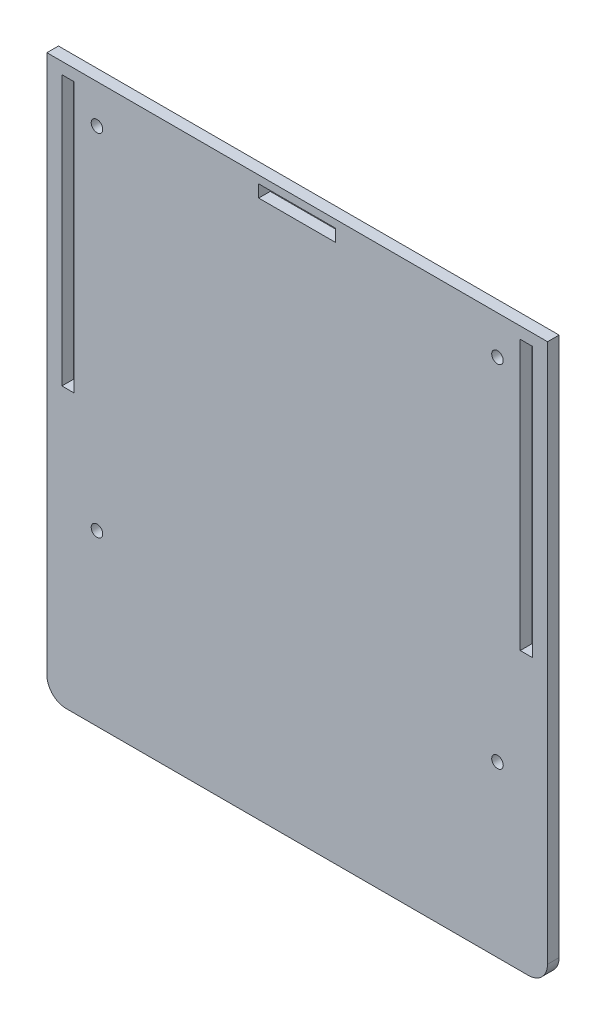
ISO-10303-21;
HEADER;
FILE_DESCRIPTION(('STEP AP214'),'2;1');
FILE_NAME('part.step','',(''),(''),'','','');
FILE_SCHEMA(('AUTOMOTIVE_DESIGN { 1 0 10303 214 1 1 1 1 }'));
ENDSEC;
DATA;
#1=APPLICATION_CONTEXT('core data for automotive mechanical design processes');
#2=APPLICATION_PROTOCOL_DEFINITION('international standard','automotive_design',2000,#1);
#3=PRODUCT_CONTEXT('',#1,'mechanical');
#4=PRODUCT('Part','Part','',(#3));
#5=PRODUCT_RELATED_PRODUCT_CATEGORY('part','',(#4));
#6=PRODUCT_DEFINITION_FORMATION('','',#4);
#7=PRODUCT_DEFINITION_CONTEXT('part definition',#1,'design');
#8=PRODUCT_DEFINITION('design','',#6,#7);
#9=PRODUCT_DEFINITION_SHAPE('','',#8);
#10=(LENGTH_UNIT() NAMED_UNIT(*) SI_UNIT(.MILLI.,.METRE.));
#11=(NAMED_UNIT(*) PLANE_ANGLE_UNIT() SI_UNIT($,.RADIAN.));
#12=(NAMED_UNIT(*) SI_UNIT($,.STERADIAN.) SOLID_ANGLE_UNIT());
#13=UNCERTAINTY_MEASURE_WITH_UNIT(LENGTH_MEASURE(1.E-05),#10,'distance_accuracy_value','');
#14=(GEOMETRIC_REPRESENTATION_CONTEXT(3) GLOBAL_UNCERTAINTY_ASSIGNED_CONTEXT((#13)) GLOBAL_UNIT_ASSIGNED_CONTEXT((#10,
#11,#12)) REPRESENTATION_CONTEXT('',''));
#15=CARTESIAN_POINT('',(0.,0.,0.));
#16=DIRECTION('',(0.,0.,1.));
#17=DIRECTION('',(1.,0.,0.));
#18=AXIS2_PLACEMENT_3D('',#15,#16,#17);
#19=CARTESIAN_POINT('',(60.,-70.,3.));
#20=DIRECTION('',(0.,0.,-1.));
#21=DIRECTION('',(-1.,0.,0.));
#22=AXIS2_PLACEMENT_3D('',#19,#20,#21);
#23=PLANE('',#22);
#24=DIRECTION('',(0.,1.,0.));
#25=VECTOR('',#24,1.);
#26=CARTESIAN_POINT('',(61.1,67.,3.));
#27=LINE('',#26,#25);
#28=CARTESIAN_POINT('',(61.1,-3.,3.));
#29=VERTEX_POINT('',#28);
#30=CARTESIAN_POINT('',(61.1,67.,3.));
#31=VERTEX_POINT('',#30);
#32=EDGE_CURVE('E216',#29,#31,#27,.T.);
#33=ORIENTED_EDGE('',*,*,#32,.F.);
#34=DIRECTION('',(1.,0.,0.));
#35=VECTOR('',#34,1.);
#36=CARTESIAN_POINT('',(57.9,-3.,3.));
#37=LINE('',#36,#35);
#38=CARTESIAN_POINT('',(57.9,-3.,3.));
#39=VERTEX_POINT('',#38);
#40=EDGE_CURVE('E227',#39,#29,#37,.T.);
#41=ORIENTED_EDGE('',*,*,#40,.F.);
#42=DIRECTION('',(0.,-1.,0.));
#43=VECTOR('',#42,1.);
#44=CARTESIAN_POINT('',(57.9,67.,3.));
#45=LINE('',#44,#43);
#46=CARTESIAN_POINT('',(57.9,67.,3.));
#47=VERTEX_POINT('',#46);
#48=EDGE_CURVE('E223',#47,#39,#45,.T.);
#49=ORIENTED_EDGE('',*,*,#48,.F.);
#50=DIRECTION('',(-1.,0.,0.));
#51=VECTOR('',#50,1.);
#52=CARTESIAN_POINT('',(61.1,67.,3.));
#53=LINE('',#52,#51);
#54=EDGE_CURVE('E219',#31,#47,#53,.T.);
#55=ORIENTED_EDGE('',*,*,#54,.F.);
#56=EDGE_LOOP('',(#33,#41,#49,#55));
#57=FACE_BOUND('',#56,.T.);
#58=DIRECTION('',(-1.,0.,0.));
#59=VECTOR('',#58,1.);
#60=CARTESIAN_POINT('',(-65.,70.,3.));
#61=LINE('',#60,#59);
#62=CARTESIAN_POINT('',(65.,70.,3.));
#63=VERTEX_POINT('',#62);
#64=CARTESIAN_POINT('',(-65.,70.,3.));
#65=VERTEX_POINT('',#64);
#66=EDGE_CURVE('E302',#63,#65,#61,.T.);
#67=ORIENTED_EDGE('',*,*,#66,.T.);
#68=DIRECTION('',(0.,-1.,0.));
#69=VECTOR('',#68,1.);
#70=CARTESIAN_POINT('',(-65.,-70.,3.));
#71=LINE('',#70,#69);
#72=CARTESIAN_POINT('',(-65.,-70.,3.));
#73=VERTEX_POINT('',#72);
#74=EDGE_CURVE('E306',#65,#73,#71,.T.);
#75=ORIENTED_EDGE('',*,*,#74,.T.);
#76=CARTESIAN_POINT('',(-60.,-70.,3.));
#77=DIRECTION('',(0.,0.,1.));
#78=DIRECTION('',(-1.,0.,0.));
#79=AXIS2_PLACEMENT_3D('',#76,#77,#78);
#80=CIRCLE('',#79,5.);
#81=CARTESIAN_POINT('',(-60.,-75.,3.));
#82=VERTEX_POINT('',#81);
#83=EDGE_CURVE('E310',#73,#82,#80,.T.);
#84=ORIENTED_EDGE('',*,*,#83,.T.);
#85=DIRECTION('',(1.,0.,0.));
#86=VECTOR('',#85,1.);
#87=CARTESIAN_POINT('',(-60.,-75.,3.));
#88=LINE('',#87,#86);
#89=CARTESIAN_POINT('',(60.,-75.,3.));
#90=VERTEX_POINT('',#89);
#91=EDGE_CURVE('E313',#82,#90,#88,.T.);
#92=ORIENTED_EDGE('',*,*,#91,.T.);
#93=CARTESIAN_POINT('',(60.,-70.,3.));
#94=DIRECTION('',(0.,0.,1.));
#95=DIRECTION('',(-1.,0.,0.));
#96=AXIS2_PLACEMENT_3D('',#93,#94,#95);
#97=CIRCLE('',#96,4.99999999999999);
#98=CARTESIAN_POINT('',(65.,-70.,3.));
#99=VERTEX_POINT('',#98);
#100=EDGE_CURVE('E316',#90,#99,#97,.T.);
#101=ORIENTED_EDGE('',*,*,#100,.T.);
#102=DIRECTION('',(0.,1.,0.));
#103=VECTOR('',#102,1.);
#104=CARTESIAN_POINT('',(65.,70.,3.));
#105=LINE('',#104,#103);
#106=EDGE_CURVE('E319',#99,#63,#105,.T.);
#107=ORIENTED_EDGE('',*,*,#106,.T.);
#108=EDGE_LOOP('',(#67,#75,#84,#92,#101,#107));
#109=FACE_BOUND('',#108,.T.);
#110=DIRECTION('',(0.,1.,0.));
#111=VECTOR('',#110,1.);
#112=CARTESIAN_POINT('',(-57.9,67.0000000000003,3.));
#113=LINE('',#112,#111);
#114=CARTESIAN_POINT('',(-57.9,-2.99999999999973,3.));
#115=VERTEX_POINT('',#114);
#116=CARTESIAN_POINT('',(-57.9,67.0000000000003,3.));
#117=VERTEX_POINT('',#116);
#118=EDGE_CURVE('E259',#115,#117,#113,.T.);
#119=ORIENTED_EDGE('',*,*,#118,.F.);
#120=DIRECTION('',(1.,0.,0.));
#121=VECTOR('',#120,1.);
#122=CARTESIAN_POINT('',(-61.1,-2.99999999999973,3.));
#123=LINE('',#122,#121);
#124=CARTESIAN_POINT('',(-61.1,-2.99999999999973,3.));
#125=VERTEX_POINT('',#124);
#126=EDGE_CURVE('E270',#125,#115,#123,.T.);
#127=ORIENTED_EDGE('',*,*,#126,.F.);
#128=DIRECTION('',(0.,-1.,0.));
#129=VECTOR('',#128,1.);
#130=CARTESIAN_POINT('',(-61.1,67.0000000000003,3.));
#131=LINE('',#130,#129);
#132=CARTESIAN_POINT('',(-61.1,67.0000000000003,3.));
#133=VERTEX_POINT('',#132);
#134=EDGE_CURVE('E266',#133,#125,#131,.T.);
#135=ORIENTED_EDGE('',*,*,#134,.F.);
#136=DIRECTION('',(-1.,0.,0.));
#137=VECTOR('',#136,1.);
#138=CARTESIAN_POINT('',(-61.1,67.0000000000003,3.));
#139=LINE('',#138,#137);
#140=EDGE_CURVE('E262',#117,#133,#139,.T.);
#141=ORIENTED_EDGE('',*,*,#140,.F.);
#142=EDGE_LOOP('',(#119,#127,#135,#141));
#143=FACE_BOUND('',#142,.T.);
#144=DIRECTION('',(0.,1.,0.));
#145=VECTOR('',#144,1.);
#146=CARTESIAN_POINT('',(10.,68.,3.));
#147=LINE('',#146,#145);
#148=CARTESIAN_POINT('',(10.,64.8,3.));
#149=VERTEX_POINT('',#148);
#150=CARTESIAN_POINT('',(10.,68.,3.));
#151=VERTEX_POINT('',#150);
#152=EDGE_CURVE('E165',#149,#151,#147,.T.);
#153=ORIENTED_EDGE('',*,*,#152,.F.);
#154=DIRECTION('',(1.,0.,0.));
#155=VECTOR('',#154,1.);
#156=CARTESIAN_POINT('',(-10.,64.8,3.));
#157=LINE('',#156,#155);
#158=CARTESIAN_POINT('',(-10.,64.8,3.));
#159=VERTEX_POINT('',#158);
#160=EDGE_CURVE('E192',#159,#149,#157,.T.);
#161=ORIENTED_EDGE('',*,*,#160,.F.);
#162=DIRECTION('',(0.,-1.,0.));
#163=VECTOR('',#162,1.);
#164=CARTESIAN_POINT('',(-10.,68.,3.));
#165=LINE('',#164,#163);
#166=CARTESIAN_POINT('',(-10.,68.,3.));
#167=VERTEX_POINT('',#166);
#168=EDGE_CURVE('E188',#167,#159,#165,.T.);
#169=ORIENTED_EDGE('',*,*,#168,.F.);
#170=DIRECTION('',(-1.,0.,0.));
#171=VECTOR('',#170,1.);
#172=CARTESIAN_POINT('',(-10.,68.,3.));
#173=LINE('',#172,#171);
#174=EDGE_CURVE('E174',#151,#167,#173,.T.);
#175=ORIENTED_EDGE('',*,*,#174,.F.);
#176=EDGE_LOOP('',(#153,#161,#169,#175));
#177=FACE_BOUND('',#176,.T.);
#178=CARTESIAN_POINT('',(-52.,-31.,3.));
#179=DIRECTION('',(0.,0.,1.));
#180=DIRECTION('',(1.,0.,0.));
#181=AXIS2_PLACEMENT_3D('',#178,#179,#180);
#182=CIRCLE('',#181,1.5);
#183=CARTESIAN_POINT('',(-50.5,-31.,3.));
#184=VERTEX_POINT('',#183);
#185=EDGE_CURVE('E200',#184,#184,#182,.T.);
#186=ORIENTED_EDGE('',*,*,#185,.F.);
#187=EDGE_LOOP('',(#186));
#188=FACE_BOUND('',#187,.T.);
#189=CARTESIAN_POINT('',(52.,-31.,3.));
#190=DIRECTION('',(0.,0.,1.));
#191=DIRECTION('',(1.,0.,0.));
#192=AXIS2_PLACEMENT_3D('',#189,#190,#191);
#193=CIRCLE('',#192,1.5);
#194=CARTESIAN_POINT('',(53.5,-31.,3.));
#195=VERTEX_POINT('',#194);
#196=EDGE_CURVE('E486',#195,#195,#193,.T.);
#197=ORIENTED_EDGE('',*,*,#196,.F.);
#198=EDGE_LOOP('',(#197));
#199=FACE_BOUND('',#198,.T.);
#200=CARTESIAN_POINT('',(52.,60.,3.));
#201=DIRECTION('',(0.,0.,1.));
#202=DIRECTION('',(1.,0.,0.));
#203=AXIS2_PLACEMENT_3D('',#200,#201,#202);
#204=CIRCLE('',#203,1.5);
#205=CARTESIAN_POINT('',(53.5,60.,3.));
#206=VERTEX_POINT('',#205);
#207=EDGE_CURVE('E478',#206,#206,#204,.T.);
#208=ORIENTED_EDGE('',*,*,#207,.F.);
#209=EDGE_LOOP('',(#208));
#210=FACE_BOUND('',#209,.T.);
#211=CARTESIAN_POINT('',(-52.,60.,3.));
#212=DIRECTION('',(0.,0.,1.));
#213=DIRECTION('',(1.,0.,0.));
#214=AXIS2_PLACEMENT_3D('',#211,#212,#213);
#215=CIRCLE('',#214,1.5);
#216=CARTESIAN_POINT('',(-50.5,60.,3.));
#217=VERTEX_POINT('',#216);
#218=EDGE_CURVE('E467',#217,#217,#215,.T.);
#219=ORIENTED_EDGE('',*,*,#218,.F.);
#220=EDGE_LOOP('',(#219));
#221=FACE_BOUND('',#220,.T.);
#222=ADVANCED_FACE('F39',(#57,#109,#143,#177,#188,#199,#210,#221),#23,.F.);
#223=CARTESIAN_POINT('',(60.,-70.,0.));
#224=DIRECTION('',(0.,0.,-1.));
#225=DIRECTION('',(-1.,0.,0.));
#226=AXIS2_PLACEMENT_3D('',#223,#224,#225);
#227=PLANE('',#226);
#228=CARTESIAN_POINT('',(52.,60.,0.));
#229=DIRECTION('',(0.,0.,1.));
#230=DIRECTION('',(1.,0.,0.));
#231=AXIS2_PLACEMENT_3D('',#228,#229,#230);
#232=CIRCLE('',#231,1.5);
#233=CARTESIAN_POINT('',(53.5,60.,0.));
#234=VERTEX_POINT('',#233);
#235=EDGE_CURVE('E475',#234,#234,#232,.T.);
#236=ORIENTED_EDGE('',*,*,#235,.T.);
#237=EDGE_LOOP('',(#236));
#238=FACE_BOUND('',#237,.T.);
#239=CARTESIAN_POINT('',(-52.,-31.,0.));
#240=DIRECTION('',(0.,0.,1.));
#241=DIRECTION('',(1.,0.,0.));
#242=AXIS2_PLACEMENT_3D('',#239,#240,#241);
#243=CIRCLE('',#242,1.5);
#244=CARTESIAN_POINT('',(-50.5,-31.,0.));
#245=VERTEX_POINT('',#244);
#246=EDGE_CURVE('E490',#245,#245,#243,.T.);
#247=ORIENTED_EDGE('',*,*,#246,.T.);
#248=EDGE_LOOP('',(#247));
#249=FACE_BOUND('',#248,.T.);
#250=DIRECTION('',(-1.,0.,0.));
#251=VECTOR('',#250,1.);
#252=CARTESIAN_POINT('',(-65.,70.,0.));
#253=LINE('',#252,#251);
#254=CARTESIAN_POINT('',(65.,70.,0.));
#255=VERTEX_POINT('',#254);
#256=CARTESIAN_POINT('',(-65.,70.,0.));
#257=VERTEX_POINT('',#256);
#258=EDGE_CURVE('E301',#255,#257,#253,.T.);
#259=ORIENTED_EDGE('',*,*,#258,.F.);
#260=DIRECTION('',(0.,1.,0.));
#261=VECTOR('',#260,1.);
#262=CARTESIAN_POINT('',(65.,70.,0.));
#263=LINE('',#262,#261);
#264=CARTESIAN_POINT('',(65.,-70.,0.));
#265=VERTEX_POINT('',#264);
#266=EDGE_CURVE('E307',#265,#255,#263,.T.);
#267=ORIENTED_EDGE('',*,*,#266,.F.);
#268=CARTESIAN_POINT('',(60.,-70.,0.));
#269=DIRECTION('',(0.,0.,1.));
#270=DIRECTION('',(-1.,0.,0.));
#271=AXIS2_PLACEMENT_3D('',#268,#269,#270);
#272=CIRCLE('',#271,4.99999999999999);
#273=CARTESIAN_POINT('',(60.,-75.,0.));
#274=VERTEX_POINT('',#273);
#275=EDGE_CURVE('E335',#274,#265,#272,.T.);
#276=ORIENTED_EDGE('',*,*,#275,.F.);
#277=DIRECTION('',(1.,0.,0.));
#278=VECTOR('',#277,1.);
#279=CARTESIAN_POINT('',(-60.,-75.,0.));
#280=LINE('',#279,#278);
#281=CARTESIAN_POINT('',(-60.,-75.,0.));
#282=VERTEX_POINT('',#281);
#283=EDGE_CURVE('E332',#282,#274,#280,.T.);
#284=ORIENTED_EDGE('',*,*,#283,.F.);
#285=CARTESIAN_POINT('',(-60.,-70.,0.));
#286=DIRECTION('',(0.,0.,1.));
#287=DIRECTION('',(-1.,0.,0.));
#288=AXIS2_PLACEMENT_3D('',#285,#286,#287);
#289=CIRCLE('',#288,5.);
#290=CARTESIAN_POINT('',(-65.,-70.,0.));
#291=VERTEX_POINT('',#290);
#292=EDGE_CURVE('E329',#291,#282,#289,.T.);
#293=ORIENTED_EDGE('',*,*,#292,.F.);
#294=DIRECTION('',(0.,-1.,0.));
#295=VECTOR('',#294,1.);
#296=CARTESIAN_POINT('',(-65.,-70.,0.));
#297=LINE('',#296,#295);
#298=EDGE_CURVE('E326',#257,#291,#297,.T.);
#299=ORIENTED_EDGE('',*,*,#298,.F.);
#300=EDGE_LOOP('',(#259,#267,#276,#284,#293,#299));
#301=FACE_BOUND('',#300,.T.);
#302=DIRECTION('',(1.,0.,0.));
#303=VECTOR('',#302,1.);
#304=CARTESIAN_POINT('',(-61.1,-2.99999999999973,0.));
#305=LINE('',#304,#303);
#306=CARTESIAN_POINT('',(-61.1,-2.99999999999973,0.));
#307=VERTEX_POINT('',#306);
#308=CARTESIAN_POINT('',(-57.9,-2.99999999999973,0.));
#309=VERTEX_POINT('',#308);
#310=EDGE_CURVE('E263',#307,#309,#305,.T.);
#311=ORIENTED_EDGE('',*,*,#310,.T.);
#312=DIRECTION('',(0.,1.,0.));
#313=VECTOR('',#312,1.);
#314=CARTESIAN_POINT('',(-57.9,67.0000000000003,0.));
#315=LINE('',#314,#313);
#316=CARTESIAN_POINT('',(-57.9,67.0000000000003,0.));
#317=VERTEX_POINT('',#316);
#318=EDGE_CURVE('E258',#309,#317,#315,.T.);
#319=ORIENTED_EDGE('',*,*,#318,.T.);
#320=DIRECTION('',(-1.,0.,0.));
#321=VECTOR('',#320,1.);
#322=CARTESIAN_POINT('',(-61.1,67.0000000000003,0.));
#323=LINE('',#322,#321);
#324=CARTESIAN_POINT('',(-61.1,67.0000000000003,0.));
#325=VERTEX_POINT('',#324);
#326=EDGE_CURVE('E277',#317,#325,#323,.T.);
#327=ORIENTED_EDGE('',*,*,#326,.T.);
#328=DIRECTION('',(0.,-1.,0.));
#329=VECTOR('',#328,1.);
#330=CARTESIAN_POINT('',(-61.1,67.0000000000003,0.));
#331=LINE('',#330,#329);
#332=EDGE_CURVE('E281',#325,#307,#331,.T.);
#333=ORIENTED_EDGE('',*,*,#332,.T.);
#334=EDGE_LOOP('',(#311,#319,#327,#333));
#335=FACE_BOUND('',#334,.T.);
#336=DIRECTION('',(1.,0.,0.));
#337=VECTOR('',#336,1.);
#338=CARTESIAN_POINT('',(57.9,-3.,0.));
#339=LINE('',#338,#337);
#340=CARTESIAN_POINT('',(57.9,-3.,0.));
#341=VERTEX_POINT('',#340);
#342=CARTESIAN_POINT('',(61.1,-3.,0.));
#343=VERTEX_POINT('',#342);
#344=EDGE_CURVE('E220',#341,#343,#339,.T.);
#345=ORIENTED_EDGE('',*,*,#344,.T.);
#346=DIRECTION('',(0.,1.,0.));
#347=VECTOR('',#346,1.);
#348=CARTESIAN_POINT('',(61.1,67.,0.));
#349=LINE('',#348,#347);
#350=CARTESIAN_POINT('',(61.1,67.,0.));
#351=VERTEX_POINT('',#350);
#352=EDGE_CURVE('E183',#343,#351,#349,.T.);
#353=ORIENTED_EDGE('',*,*,#352,.T.);
#354=DIRECTION('',(-1.,0.,0.));
#355=VECTOR('',#354,1.);
#356=CARTESIAN_POINT('',(61.1,67.,0.));
#357=LINE('',#356,#355);
#358=CARTESIAN_POINT('',(57.9,67.,0.));
#359=VERTEX_POINT('',#358);
#360=EDGE_CURVE('E234',#351,#359,#357,.T.);
#361=ORIENTED_EDGE('',*,*,#360,.T.);
#362=DIRECTION('',(0.,-1.,0.));
#363=VECTOR('',#362,1.);
#364=CARTESIAN_POINT('',(57.9,67.,0.));
#365=LINE('',#364,#363);
#366=EDGE_CURVE('E238',#359,#341,#365,.T.);
#367=ORIENTED_EDGE('',*,*,#366,.T.);
#368=EDGE_LOOP('',(#345,#353,#361,#367));
#369=FACE_BOUND('',#368,.T.);
#370=DIRECTION('',(1.,0.,0.));
#371=VECTOR('',#370,1.);
#372=CARTESIAN_POINT('',(-10.,64.8,0.));
#373=LINE('',#372,#371);
#374=CARTESIAN_POINT('',(-10.,64.8,0.));
#375=VERTEX_POINT('',#374);
#376=CARTESIAN_POINT('',(10.,64.8,0.));
#377=VERTEX_POINT('',#376);
#378=EDGE_CURVE('E175',#375,#377,#373,.T.);
#379=ORIENTED_EDGE('',*,*,#378,.T.);
#380=DIRECTION('',(0.,1.,0.));
#381=VECTOR('',#380,1.);
#382=CARTESIAN_POINT('',(10.,68.,0.));
#383=LINE('',#382,#381);
#384=CARTESIAN_POINT('',(10.,68.,0.));
#385=VERTEX_POINT('',#384);
#386=EDGE_CURVE('E63',#377,#385,#383,.T.);
#387=ORIENTED_EDGE('',*,*,#386,.T.);
#388=DIRECTION('',(-1.,0.,0.));
#389=VECTOR('',#388,1.);
#390=CARTESIAN_POINT('',(-10.,68.,0.));
#391=LINE('',#390,#389);
#392=CARTESIAN_POINT('',(-10.,68.,0.));
#393=VERTEX_POINT('',#392);
#394=EDGE_CURVE('E181',#385,#393,#391,.T.);
#395=ORIENTED_EDGE('',*,*,#394,.T.);
#396=DIRECTION('',(0.,-1.,0.));
#397=VECTOR('',#396,1.);
#398=CARTESIAN_POINT('',(-10.,68.,0.));
#399=LINE('',#398,#397);
#400=EDGE_CURVE('E203',#393,#375,#399,.T.);
#401=ORIENTED_EDGE('',*,*,#400,.T.);
#402=EDGE_LOOP('',(#379,#387,#395,#401));
#403=FACE_BOUND('',#402,.T.);
#404=CARTESIAN_POINT('',(52.,-31.,0.));
#405=DIRECTION('',(0.,0.,1.));
#406=DIRECTION('',(1.,0.,0.));
#407=AXIS2_PLACEMENT_3D('',#404,#405,#406);
#408=CIRCLE('',#407,1.5);
#409=CARTESIAN_POINT('',(53.5,-31.,0.));
#410=VERTEX_POINT('',#409);
#411=EDGE_CURVE('E482',#410,#410,#408,.T.);
#412=ORIENTED_EDGE('',*,*,#411,.T.);
#413=EDGE_LOOP('',(#412));
#414=FACE_BOUND('',#413,.T.);
#415=CARTESIAN_POINT('',(-52.,60.,0.));
#416=DIRECTION('',(0.,0.,1.));
#417=DIRECTION('',(1.,0.,0.));
#418=AXIS2_PLACEMENT_3D('',#415,#416,#417);
#419=CIRCLE('',#418,1.5);
#420=CARTESIAN_POINT('',(-50.5,60.,0.));
#421=VERTEX_POINT('',#420);
#422=EDGE_CURVE('E470',#421,#421,#419,.T.);
#423=ORIENTED_EDGE('',*,*,#422,.T.);
#424=EDGE_LOOP('',(#423));
#425=FACE_BOUND('',#424,.T.);
#426=ADVANCED_FACE('F366',(#238,#249,#301,#335,#369,#403,#414,#425),#227,.T.);
#427=CARTESIAN_POINT('',(-65.,70.,3.));
#428=DIRECTION('',(0.,-1.,0.));
#429=DIRECTION('',(0.,0.,-1.));
#430=AXIS2_PLACEMENT_3D('',#427,#428,#429);
#431=PLANE('',#430);
#432=ORIENTED_EDGE('',*,*,#258,.T.);
#433=DIRECTION('',(0.,0.,-1.));
#434=VECTOR('',#433,1.);
#435=CARTESIAN_POINT('',(-65.,70.,3.));
#436=LINE('',#435,#434);
#437=EDGE_CURVE('E11',#65,#257,#436,.T.);
#438=ORIENTED_EDGE('',*,*,#437,.F.);
#439=ORIENTED_EDGE('',*,*,#66,.F.);
#440=DIRECTION('',(0.,0.,-1.));
#441=VECTOR('',#440,1.);
#442=CARTESIAN_POINT('',(65.,70.,3.));
#443=LINE('',#442,#441);
#444=EDGE_CURVE('E322',#63,#255,#443,.T.);
#445=ORIENTED_EDGE('',*,*,#444,.T.);
#446=EDGE_LOOP('',(#432,#438,#439,#445));
#447=FACE_BOUND('',#446,.T.);
#448=ADVANCED_FACE('F41',(#447),#431,.F.);
#449=CARTESIAN_POINT('',(-65.,-70.,3.));
#450=DIRECTION('',(1.,0.,0.));
#451=DIRECTION('',(0.,0.,-1.));
#452=AXIS2_PLACEMENT_3D('',#449,#450,#451);
#453=PLANE('',#452);
#454=ORIENTED_EDGE('',*,*,#298,.T.);
#455=DIRECTION('',(0.,0.,-1.));
#456=VECTOR('',#455,1.);
#457=CARTESIAN_POINT('',(-65.,-70.,3.));
#458=LINE('',#457,#456);
#459=EDGE_CURVE('E48',#73,#291,#458,.T.);
#460=ORIENTED_EDGE('',*,*,#459,.F.);
#461=ORIENTED_EDGE('',*,*,#74,.F.);
#462=ORIENTED_EDGE('',*,*,#437,.T.);
#463=EDGE_LOOP('',(#454,#460,#461,#462));
#464=FACE_BOUND('',#463,.T.);
#465=ADVANCED_FACE('F384',(#464),#453,.F.);
#466=CARTESIAN_POINT('',(-60.,-70.,3.));
#467=DIRECTION('',(0.,0.,-1.));
#468=DIRECTION('',(-1.,0.,0.));
#469=AXIS2_PLACEMENT_3D('',#466,#467,#468);
#470=CYLINDRICAL_SURFACE('',#469,5.);
#471=ORIENTED_EDGE('',*,*,#292,.T.);
#472=DIRECTION('',(0.,0.,-1.));
#473=VECTOR('',#472,1.);
#474=CARTESIAN_POINT('',(-60.,-75.,3.));
#475=LINE('',#474,#473);
#476=EDGE_CURVE('E351',#82,#282,#475,.T.);
#477=ORIENTED_EDGE('',*,*,#476,.F.);
#478=ORIENTED_EDGE('',*,*,#83,.F.);
#479=ORIENTED_EDGE('',*,*,#459,.T.);
#480=EDGE_LOOP('',(#471,#477,#478,#479));
#481=FACE_BOUND('',#480,.T.);
#482=ADVANCED_FACE('F360',(#481),#470,.T.);
#483=CARTESIAN_POINT('',(-60.,-75.,3.));
#484=DIRECTION('',(0.,1.,0.));
#485=DIRECTION('',(0.,0.,1.));
#486=AXIS2_PLACEMENT_3D('',#483,#484,#485);
#487=PLANE('',#486);
#488=ORIENTED_EDGE('',*,*,#283,.T.);
#489=DIRECTION('',(0.,0.,-1.));
#490=VECTOR('',#489,1.);
#491=CARTESIAN_POINT('',(60.,-75.,3.));
#492=LINE('',#491,#490);
#493=EDGE_CURVE('E347',#90,#274,#492,.T.);
#494=ORIENTED_EDGE('',*,*,#493,.F.);
#495=ORIENTED_EDGE('',*,*,#91,.F.);
#496=ORIENTED_EDGE('',*,*,#476,.T.);
#497=EDGE_LOOP('',(#488,#494,#495,#496));
#498=FACE_BOUND('',#497,.T.);
#499=ADVANCED_FACE('F372',(#498),#487,.F.);
#500=CARTESIAN_POINT('',(60.,-70.,3.));
#501=DIRECTION('',(0.,0.,-1.));
#502=DIRECTION('',(-1.,0.,0.));
#503=AXIS2_PLACEMENT_3D('',#500,#501,#502);
#504=CYLINDRICAL_SURFACE('',#503,4.99999999999999);
#505=ORIENTED_EDGE('',*,*,#275,.T.);
#506=DIRECTION('',(0.,0.,-1.));
#507=VECTOR('',#506,1.);
#508=CARTESIAN_POINT('',(65.,-70.,3.));
#509=LINE('',#508,#507);
#510=EDGE_CURVE('E343',#99,#265,#509,.T.);
#511=ORIENTED_EDGE('',*,*,#510,.F.);
#512=ORIENTED_EDGE('',*,*,#100,.F.);
#513=ORIENTED_EDGE('',*,*,#493,.T.);
#514=EDGE_LOOP('',(#505,#511,#512,#513));
#515=FACE_BOUND('',#514,.T.);
#516=ADVANCED_FACE('F376',(#515),#504,.T.);
#517=CARTESIAN_POINT('',(65.,70.,3.));
#518=DIRECTION('',(-1.,0.,0.));
#519=DIRECTION('',(0.,0.,1.));
#520=AXIS2_PLACEMENT_3D('',#517,#518,#519);
#521=PLANE('',#520);
#522=ORIENTED_EDGE('',*,*,#266,.T.);
#523=ORIENTED_EDGE('',*,*,#444,.F.);
#524=ORIENTED_EDGE('',*,*,#106,.F.);
#525=ORIENTED_EDGE('',*,*,#510,.T.);
#526=EDGE_LOOP('',(#522,#523,#524,#525));
#527=FACE_BOUND('',#526,.T.);
#528=ADVANCED_FACE('F387',(#527),#521,.F.);
#529=CARTESIAN_POINT('',(-57.9,67.0000000000003,3.));
#530=DIRECTION('',(-1.,0.,0.));
#531=DIRECTION('',(0.,-1.,0.));
#532=AXIS2_PLACEMENT_3D('',#529,#530,#531);
#533=PLANE('',#532);
#534=ORIENTED_EDGE('',*,*,#318,.F.);
#535=DIRECTION('',(0.,0.,-1.));
#536=VECTOR('',#535,1.);
#537=CARTESIAN_POINT('',(-57.9,-2.99999999999973,3.));
#538=LINE('',#537,#536);
#539=EDGE_CURVE('E273',#115,#309,#538,.T.);
#540=ORIENTED_EDGE('',*,*,#539,.F.);
#541=ORIENTED_EDGE('',*,*,#118,.T.);
#542=DIRECTION('',(0.,0.,-1.));
#543=VECTOR('',#542,1.);
#544=CARTESIAN_POINT('',(-57.9,67.0000000000003,3.));
#545=LINE('',#544,#543);
#546=EDGE_CURVE('E297',#117,#317,#545,.T.);
#547=ORIENTED_EDGE('',*,*,#546,.T.);
#548=EDGE_LOOP('',(#534,#540,#541,#547));
#549=FACE_BOUND('',#548,.T.);
#550=ADVANCED_FACE('F389',(#549),#533,.T.);
#551=CARTESIAN_POINT('',(-61.1,67.0000000000003,3.));
#552=DIRECTION('',(0.,-1.,0.));
#553=DIRECTION('',(0.,0.,-1.));
#554=AXIS2_PLACEMENT_3D('',#551,#552,#553);
#555=PLANE('',#554);
#556=ORIENTED_EDGE('',*,*,#326,.F.);
#557=ORIENTED_EDGE('',*,*,#546,.F.);
#558=ORIENTED_EDGE('',*,*,#140,.T.);
#559=DIRECTION('',(0.,0.,-1.));
#560=VECTOR('',#559,1.);
#561=CARTESIAN_POINT('',(-61.1,67.0000000000003,3.));
#562=LINE('',#561,#560);
#563=EDGE_CURVE('E294',#133,#325,#562,.T.);
#564=ORIENTED_EDGE('',*,*,#563,.T.);
#565=EDGE_LOOP('',(#556,#557,#558,#564));
#566=FACE_BOUND('',#565,.T.);
#567=ADVANCED_FACE('F395',(#566),#555,.T.);
#568=CARTESIAN_POINT('',(-61.1,67.0000000000003,3.));
#569=DIRECTION('',(1.,0.,0.));
#570=DIRECTION('',(0.,1.,0.));
#571=AXIS2_PLACEMENT_3D('',#568,#569,#570);
#572=PLANE('',#571);
#573=ORIENTED_EDGE('',*,*,#332,.F.);
#574=ORIENTED_EDGE('',*,*,#563,.F.);
#575=ORIENTED_EDGE('',*,*,#134,.T.);
#576=DIRECTION('',(0.,0.,-1.));
#577=VECTOR('',#576,1.);
#578=CARTESIAN_POINT('',(-61.1,-2.99999999999973,3.));
#579=LINE('',#578,#577);
#580=EDGE_CURVE('E291',#125,#307,#579,.T.);
#581=ORIENTED_EDGE('',*,*,#580,.T.);
#582=EDGE_LOOP('',(#573,#574,#575,#581));
#583=FACE_BOUND('',#582,.T.);
#584=ADVANCED_FACE('F411',(#583),#572,.T.);
#585=CARTESIAN_POINT('',(-61.1,-2.99999999999973,3.));
#586=DIRECTION('',(0.,1.,0.));
#587=DIRECTION('',(0.,0.,1.));
#588=AXIS2_PLACEMENT_3D('',#585,#586,#587);
#589=PLANE('',#588);
#590=ORIENTED_EDGE('',*,*,#310,.F.);
#591=ORIENTED_EDGE('',*,*,#580,.F.);
#592=ORIENTED_EDGE('',*,*,#126,.T.);
#593=ORIENTED_EDGE('',*,*,#539,.T.);
#594=EDGE_LOOP('',(#590,#591,#592,#593));
#595=FACE_BOUND('',#594,.T.);
#596=ADVANCED_FACE('F415',(#595),#589,.T.);
#597=CARTESIAN_POINT('',(61.1,67.,3.));
#598=DIRECTION('',(-1.,0.,0.));
#599=DIRECTION('',(0.,-1.,0.));
#600=AXIS2_PLACEMENT_3D('',#597,#598,#599);
#601=PLANE('',#600);
#602=ORIENTED_EDGE('',*,*,#352,.F.);
#603=DIRECTION('',(0.,0.,-1.));
#604=VECTOR('',#603,1.);
#605=CARTESIAN_POINT('',(61.1,-3.,3.));
#606=LINE('',#605,#604);
#607=EDGE_CURVE('E230',#29,#343,#606,.T.);
#608=ORIENTED_EDGE('',*,*,#607,.F.);
#609=ORIENTED_EDGE('',*,*,#32,.T.);
#610=DIRECTION('',(0.,0.,-1.));
#611=VECTOR('',#610,1.);
#612=CARTESIAN_POINT('',(61.1,67.,3.));
#613=LINE('',#612,#611);
#614=EDGE_CURVE('E254',#31,#351,#613,.T.);
#615=ORIENTED_EDGE('',*,*,#614,.T.);
#616=EDGE_LOOP('',(#602,#608,#609,#615));
#617=FACE_BOUND('',#616,.T.);
#618=ADVANCED_FACE('F419',(#617),#601,.T.);
#619=CARTESIAN_POINT('',(61.1,67.,3.));
#620=DIRECTION('',(0.,-1.,0.));
#621=DIRECTION('',(0.,0.,-1.));
#622=AXIS2_PLACEMENT_3D('',#619,#620,#621);
#623=PLANE('',#622);
#624=ORIENTED_EDGE('',*,*,#360,.F.);
#625=ORIENTED_EDGE('',*,*,#614,.F.);
#626=ORIENTED_EDGE('',*,*,#54,.T.);
#627=DIRECTION('',(0.,0.,-1.));
#628=VECTOR('',#627,1.);
#629=CARTESIAN_POINT('',(57.9,67.,3.));
#630=LINE('',#629,#628);
#631=EDGE_CURVE('E251',#47,#359,#630,.T.);
#632=ORIENTED_EDGE('',*,*,#631,.T.);
#633=EDGE_LOOP('',(#624,#625,#626,#632));
#634=FACE_BOUND('',#633,.T.);
#635=ADVANCED_FACE('F423',(#634),#623,.T.);
#636=CARTESIAN_POINT('',(57.9,67.,3.));
#637=DIRECTION('',(1.,0.,0.));
#638=DIRECTION('',(0.,1.,0.));
#639=AXIS2_PLACEMENT_3D('',#636,#637,#638);
#640=PLANE('',#639);
#641=ORIENTED_EDGE('',*,*,#366,.F.);
#642=ORIENTED_EDGE('',*,*,#631,.F.);
#643=ORIENTED_EDGE('',*,*,#48,.T.);
#644=DIRECTION('',(0.,0.,-1.));
#645=VECTOR('',#644,1.);
#646=CARTESIAN_POINT('',(57.9,-3.,3.));
#647=LINE('',#646,#645);
#648=EDGE_CURVE('E248',#39,#341,#647,.T.);
#649=ORIENTED_EDGE('',*,*,#648,.T.);
#650=EDGE_LOOP('',(#641,#642,#643,#649));
#651=FACE_BOUND('',#650,.T.);
#652=ADVANCED_FACE('F427',(#651),#640,.T.);
#653=CARTESIAN_POINT('',(57.9,-3.,3.));
#654=DIRECTION('',(0.,1.,0.));
#655=DIRECTION('',(-1.,0.,0.));
#656=AXIS2_PLACEMENT_3D('',#653,#654,#655);
#657=PLANE('',#656);
#658=ORIENTED_EDGE('',*,*,#344,.F.);
#659=ORIENTED_EDGE('',*,*,#648,.F.);
#660=ORIENTED_EDGE('',*,*,#40,.T.);
#661=ORIENTED_EDGE('',*,*,#607,.T.);
#662=EDGE_LOOP('',(#658,#659,#660,#661));
#663=FACE_BOUND('',#662,.T.);
#664=ADVANCED_FACE('F431',(#663),#657,.T.);
#665=CARTESIAN_POINT('',(10.,68.,3.));
#666=DIRECTION('',(-1.,0.,0.));
#667=DIRECTION('',(0.,0.,1.));
#668=AXIS2_PLACEMENT_3D('',#665,#666,#667);
#669=PLANE('',#668);
#670=ORIENTED_EDGE('',*,*,#386,.F.);
#671=DIRECTION('',(0.,0.,-1.));
#672=VECTOR('',#671,1.);
#673=CARTESIAN_POINT('',(10.,64.8,3.));
#674=LINE('',#673,#672);
#675=EDGE_CURVE('E169',#149,#377,#674,.T.);
#676=ORIENTED_EDGE('',*,*,#675,.F.);
#677=ORIENTED_EDGE('',*,*,#152,.T.);
#678=DIRECTION('',(0.,0.,-1.));
#679=VECTOR('',#678,1.);
#680=CARTESIAN_POINT('',(10.,68.,3.));
#681=LINE('',#680,#679);
#682=EDGE_CURVE('E168',#151,#385,#681,.T.);
#683=ORIENTED_EDGE('',*,*,#682,.T.);
#684=EDGE_LOOP('',(#670,#676,#677,#683));
#685=FACE_BOUND('',#684,.T.);
#686=ADVANCED_FACE('F167',(#685),#669,.T.);
#687=CARTESIAN_POINT('',(-10.,68.,3.));
#688=DIRECTION('',(0.,-1.,0.));
#689=DIRECTION('',(0.,0.,-1.));
#690=AXIS2_PLACEMENT_3D('',#687,#688,#689);
#691=PLANE('',#690);
#692=ORIENTED_EDGE('',*,*,#394,.F.);
#693=ORIENTED_EDGE('',*,*,#682,.F.);
#694=ORIENTED_EDGE('',*,*,#174,.T.);
#695=DIRECTION('',(0.,0.,-1.));
#696=VECTOR('',#695,1.);
#697=CARTESIAN_POINT('',(-10.,68.,3.));
#698=LINE('',#697,#696);
#699=EDGE_CURVE('E184',#167,#393,#698,.T.);
#700=ORIENTED_EDGE('',*,*,#699,.T.);
#701=EDGE_LOOP('',(#692,#693,#694,#700));
#702=FACE_BOUND('',#701,.T.);
#703=ADVANCED_FACE('F178',(#702),#691,.T.);
#704=CARTESIAN_POINT('',(-10.,68.,3.));
#705=DIRECTION('',(1.,0.,0.));
#706=DIRECTION('',(0.,0.,-1.));
#707=AXIS2_PLACEMENT_3D('',#704,#705,#706);
#708=PLANE('',#707);
#709=ORIENTED_EDGE('',*,*,#400,.F.);
#710=ORIENTED_EDGE('',*,*,#699,.F.);
#711=ORIENTED_EDGE('',*,*,#168,.T.);
#712=DIRECTION('',(0.,0.,-1.));
#713=VECTOR('',#712,1.);
#714=CARTESIAN_POINT('',(-10.,64.8,3.));
#715=LINE('',#714,#713);
#716=EDGE_CURVE('E55',#159,#375,#715,.T.);
#717=ORIENTED_EDGE('',*,*,#716,.T.);
#718=EDGE_LOOP('',(#709,#710,#711,#717));
#719=FACE_BOUND('',#718,.T.);
#720=ADVANCED_FACE('F440',(#719),#708,.T.);
#721=CARTESIAN_POINT('',(-10.,64.8,3.));
#722=DIRECTION('',(0.,1.,0.));
#723=DIRECTION('',(0.,0.,1.));
#724=AXIS2_PLACEMENT_3D('',#721,#722,#723);
#725=PLANE('',#724);
#726=ORIENTED_EDGE('',*,*,#378,.F.);
#727=ORIENTED_EDGE('',*,*,#716,.F.);
#728=ORIENTED_EDGE('',*,*,#160,.T.);
#729=ORIENTED_EDGE('',*,*,#675,.T.);
#730=EDGE_LOOP('',(#726,#727,#728,#729));
#731=FACE_BOUND('',#730,.T.);
#732=ADVANCED_FACE('F443',(#731),#725,.T.);
#733=CARTESIAN_POINT('',(-52.,-31.,3.));
#734=DIRECTION('',(0.,0.,-1.));
#735=DIRECTION('',(-1.,0.,0.));
#736=AXIS2_PLACEMENT_3D('',#733,#734,#735);
#737=CYLINDRICAL_SURFACE('',#736,1.5);
#738=ORIENTED_EDGE('',*,*,#185,.T.);
#739=EDGE_LOOP('',(#738));
#740=FACE_BOUND('',#739,.T.);
#741=ORIENTED_EDGE('',*,*,#246,.F.);
#742=EDGE_LOOP('',(#741));
#743=FACE_BOUND('',#742,.T.);
#744=ADVANCED_FACE('F447',(#740,#743),#737,.F.);
#745=CARTESIAN_POINT('',(52.,-31.,3.));
#746=DIRECTION('',(0.,0.,-1.));
#747=DIRECTION('',(-1.,0.,0.));
#748=AXIS2_PLACEMENT_3D('',#745,#746,#747);
#749=CYLINDRICAL_SURFACE('',#748,1.5);
#750=ORIENTED_EDGE('',*,*,#196,.T.);
#751=EDGE_LOOP('',(#750));
#752=FACE_BOUND('',#751,.T.);
#753=ORIENTED_EDGE('',*,*,#411,.F.);
#754=EDGE_LOOP('',(#753));
#755=FACE_BOUND('',#754,.T.);
#756=ADVANCED_FACE('F450',(#752,#755),#749,.F.);
#757=CARTESIAN_POINT('',(52.,60.,3.));
#758=DIRECTION('',(0.,0.,-1.));
#759=DIRECTION('',(-1.,0.,0.));
#760=AXIS2_PLACEMENT_3D('',#757,#758,#759);
#761=CYLINDRICAL_SURFACE('',#760,1.5);
#762=ORIENTED_EDGE('',*,*,#207,.T.);
#763=EDGE_LOOP('',(#762));
#764=FACE_BOUND('',#763,.T.);
#765=ORIENTED_EDGE('',*,*,#235,.F.);
#766=EDGE_LOOP('',(#765));
#767=FACE_BOUND('',#766,.T.);
#768=ADVANCED_FACE('F454',(#764,#767),#761,.F.);
#769=CARTESIAN_POINT('',(-52.,60.,3.));
#770=DIRECTION('',(0.,0.,-1.));
#771=DIRECTION('',(-1.,0.,0.));
#772=AXIS2_PLACEMENT_3D('',#769,#770,#771);
#773=CYLINDRICAL_SURFACE('',#772,1.5);
#774=ORIENTED_EDGE('',*,*,#218,.T.);
#775=EDGE_LOOP('',(#774));
#776=FACE_BOUND('',#775,.T.);
#777=ORIENTED_EDGE('',*,*,#422,.F.);
#778=EDGE_LOOP('',(#777));
#779=FACE_BOUND('',#778,.T.);
#780=ADVANCED_FACE('F458',(#776,#779),#773,.F.);
#781=CLOSED_SHELL('',(#222,#426,#448,#465,#482,#499,#516,#528,#550,#567,#584,#596,#618,#635,
#652,#664,#686,#703,#720,#732,#744,#756,#768,#780));
#782=MANIFOLD_SOLID_BREP('B2',#781);
#783=ADVANCED_BREP_SHAPE_REPRESENTATION('',(#18,#782),#14);
#784=SHAPE_DEFINITION_REPRESENTATION(#9,#783);
ENDSEC;
END-ISO-10303-21;
